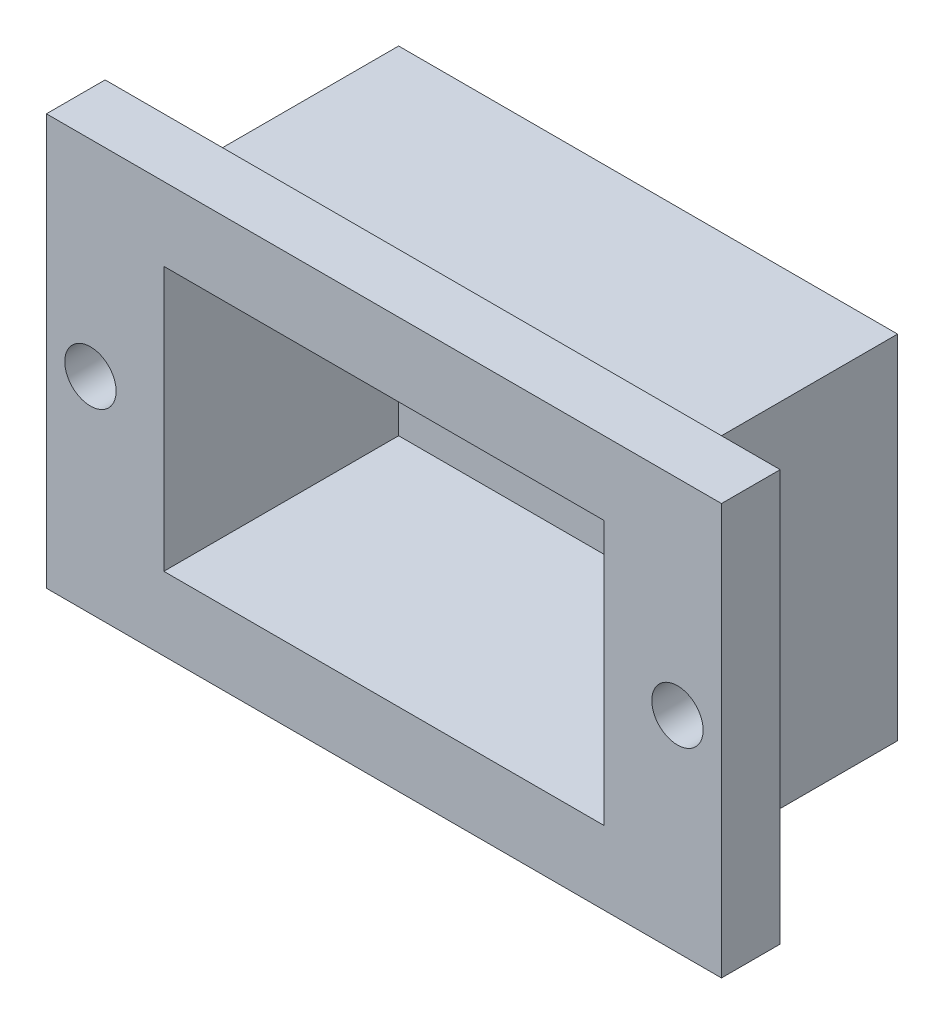
ISO-10303-21;
HEADER;
FILE_DESCRIPTION(('STEP AP214'),'2;1');
FILE_NAME('part.step','',(''),(''),'','','');
FILE_SCHEMA(('AUTOMOTIVE_DESIGN { 1 0 10303 214 1 1 1 1 }'));
ENDSEC;
DATA;
#1=APPLICATION_CONTEXT('core data for automotive mechanical design processes');
#2=APPLICATION_PROTOCOL_DEFINITION('international standard','automotive_design',2000,#1);
#3=PRODUCT_CONTEXT('',#1,'mechanical');
#4=PRODUCT('Part','Part','',(#3));
#5=PRODUCT_RELATED_PRODUCT_CATEGORY('part','',(#4));
#6=PRODUCT_DEFINITION_FORMATION('','',#4);
#7=PRODUCT_DEFINITION_CONTEXT('part definition',#1,'design');
#8=PRODUCT_DEFINITION('design','',#6,#7);
#9=PRODUCT_DEFINITION_SHAPE('','',#8);
#10=(LENGTH_UNIT() NAMED_UNIT(*) SI_UNIT(.MILLI.,.METRE.));
#11=(NAMED_UNIT(*) PLANE_ANGLE_UNIT() SI_UNIT($,.RADIAN.));
#12=(NAMED_UNIT(*) SI_UNIT($,.STERADIAN.) SOLID_ANGLE_UNIT());
#13=UNCERTAINTY_MEASURE_WITH_UNIT(LENGTH_MEASURE(1.E-05),#10,'distance_accuracy_value','');
#14=(GEOMETRIC_REPRESENTATION_CONTEXT(3) GLOBAL_UNCERTAINTY_ASSIGNED_CONTEXT((#13)) GLOBAL_UNIT_ASSIGNED_CONTEXT((#10,
#11,#12)) REPRESENTATION_CONTEXT('',''));
#15=CARTESIAN_POINT('',(0.,0.,0.));
#16=DIRECTION('',(0.,0.,1.));
#17=DIRECTION('',(1.,0.,0.));
#18=AXIS2_PLACEMENT_3D('',#15,#16,#17);
#19=CARTESIAN_POINT('',(-23.,14.,2.));
#20=DIRECTION('',(1.,0.,0.));
#21=DIRECTION('',(0.,1.,0.));
#22=AXIS2_PLACEMENT_3D('',#19,#20,#21);
#23=PLANE('',#22);
#24=DIRECTION('',(0.,0.,-1.));
#25=VECTOR('',#24,1.);
#26=CARTESIAN_POINT('',(-23.,14.,2.));
#27=LINE('',#26,#25);
#28=CARTESIAN_POINT('',(-23.,14.,18.));
#29=VERTEX_POINT('',#28);
#30=CARTESIAN_POINT('',(-23.,14.,14.));
#31=VERTEX_POINT('',#30);
#32=EDGE_CURVE('E223',#29,#31,#27,.T.);
#33=ORIENTED_EDGE('',*,*,#32,.T.);
#34=DIRECTION('',(0.,-1.,0.));
#35=VECTOR('',#34,1.);
#36=CARTESIAN_POINT('',(-23.,14.,14.));
#37=LINE('',#36,#35);
#38=CARTESIAN_POINT('',(-23.,-14.,14.));
#39=VERTEX_POINT('',#38);
#40=EDGE_CURVE('E243',#31,#39,#37,.T.);
#41=ORIENTED_EDGE('',*,*,#40,.T.);
#42=DIRECTION('',(0.,0.,-1.));
#43=VECTOR('',#42,1.);
#44=CARTESIAN_POINT('',(-23.,-14.,2.));
#45=LINE('',#44,#43);
#46=CARTESIAN_POINT('',(-23.,-14.,18.));
#47=VERTEX_POINT('',#46);
#48=EDGE_CURVE('E235',#47,#39,#45,.T.);
#49=ORIENTED_EDGE('',*,*,#48,.F.);
#50=DIRECTION('',(0.,-1.,0.));
#51=VECTOR('',#50,1.);
#52=CARTESIAN_POINT('',(-23.,-14.,18.));
#53=LINE('',#52,#51);
#54=EDGE_CURVE('E207',#29,#47,#53,.T.);
#55=ORIENTED_EDGE('',*,*,#54,.F.);
#56=EDGE_LOOP('',(#33,#41,#49,#55));
#57=FACE_BOUND('',#56,.T.);
#58=ADVANCED_FACE('F38',(#57),#23,.F.);
#59=CARTESIAN_POINT('',(-23.,-14.,2.));
#60=DIRECTION('',(0.,1.,0.));
#61=DIRECTION('',(0.,0.,1.));
#62=AXIS2_PLACEMENT_3D('',#59,#60,#61);
#63=PLANE('',#62);
#64=DIRECTION('',(-1.,0.,0.));
#65=VECTOR('',#64,1.);
#66=CARTESIAN_POINT('',(-23.,-14.,14.));
#67=LINE('',#66,#65);
#68=CARTESIAN_POINT('',(23.,-14.,14.));
#69=VERTEX_POINT('',#68);
#70=EDGE_CURVE('E151',#69,#39,#67,.T.);
#71=ORIENTED_EDGE('',*,*,#70,.F.);
#72=DIRECTION('',(0.,0.,-1.));
#73=VECTOR('',#72,1.);
#74=CARTESIAN_POINT('',(23.,-14.,2.));
#75=LINE('',#74,#73);
#76=CARTESIAN_POINT('',(23.,-14.,18.));
#77=VERTEX_POINT('',#76);
#78=EDGE_CURVE('E231',#77,#69,#75,.T.);
#79=ORIENTED_EDGE('',*,*,#78,.F.);
#80=DIRECTION('',(1.,0.,0.));
#81=VECTOR('',#80,1.);
#82=CARTESIAN_POINT('',(23.,-14.,18.));
#83=LINE('',#82,#81);
#84=EDGE_CURVE('E211',#47,#77,#83,.T.);
#85=ORIENTED_EDGE('',*,*,#84,.F.);
#86=ORIENTED_EDGE('',*,*,#48,.T.);
#87=EDGE_LOOP('',(#71,#79,#85,#86));
#88=FACE_BOUND('',#87,.T.);
#89=ADVANCED_FACE('F290',(#88),#63,.F.);
#90=CARTESIAN_POINT('',(23.,14.,2.));
#91=DIRECTION('',(-1.,0.,0.));
#92=DIRECTION('',(0.,0.,1.));
#93=AXIS2_PLACEMENT_3D('',#90,#91,#92);
#94=PLANE('',#93);
#95=ORIENTED_EDGE('',*,*,#78,.T.);
#96=DIRECTION('',(0.,-1.,0.));
#97=VECTOR('',#96,1.);
#98=CARTESIAN_POINT('',(23.,14.,14.));
#99=LINE('',#98,#97);
#100=CARTESIAN_POINT('',(23.,14.,14.));
#101=VERTEX_POINT('',#100);
#102=EDGE_CURVE('E147',#101,#69,#99,.T.);
#103=ORIENTED_EDGE('',*,*,#102,.F.);
#104=DIRECTION('',(0.,0.,-1.));
#105=VECTOR('',#104,1.);
#106=CARTESIAN_POINT('',(23.,14.,2.));
#107=LINE('',#106,#105);
#108=CARTESIAN_POINT('',(23.,14.,18.));
#109=VERTEX_POINT('',#108);
#110=EDGE_CURVE('E227',#109,#101,#107,.T.);
#111=ORIENTED_EDGE('',*,*,#110,.F.);
#112=DIRECTION('',(0.,1.,0.));
#113=VECTOR('',#112,1.);
#114=CARTESIAN_POINT('',(23.,14.,18.));
#115=LINE('',#114,#113);
#116=EDGE_CURVE('E215',#77,#109,#115,.T.);
#117=ORIENTED_EDGE('',*,*,#116,.F.);
#118=EDGE_LOOP('',(#95,#103,#111,#117));
#119=FACE_BOUND('',#118,.T.);
#120=ADVANCED_FACE('F296',(#119),#94,.F.);
#121=CARTESIAN_POINT('',(-23.,14.,2.));
#122=DIRECTION('',(0.,-1.,0.));
#123=DIRECTION('',(1.,0.,0.));
#124=AXIS2_PLACEMENT_3D('',#121,#122,#123);
#125=PLANE('',#124);
#126=ORIENTED_EDGE('',*,*,#110,.T.);
#127=DIRECTION('',(-1.,0.,0.));
#128=VECTOR('',#127,1.);
#129=CARTESIAN_POINT('',(-23.,14.,14.));
#130=LINE('',#129,#128);
#131=EDGE_CURVE('E259',#101,#31,#130,.T.);
#132=ORIENTED_EDGE('',*,*,#131,.T.);
#133=ORIENTED_EDGE('',*,*,#32,.F.);
#134=DIRECTION('',(-1.,0.,0.));
#135=VECTOR('',#134,1.);
#136=CARTESIAN_POINT('',(-23.,14.,18.));
#137=LINE('',#136,#135);
#138=EDGE_CURVE('E219',#109,#29,#137,.T.);
#139=ORIENTED_EDGE('',*,*,#138,.F.);
#140=EDGE_LOOP('',(#126,#132,#133,#139));
#141=FACE_BOUND('',#140,.T.);
#142=ADVANCED_FACE('F301',(#141),#125,.F.);
#143=CARTESIAN_POINT('',(0.,0.,0.));
#144=DIRECTION('',(0.,0.,1.));
#145=DIRECTION('',(1.,0.,0.));
#146=AXIS2_PLACEMENT_3D('',#143,#144,#145);
#147=PLANE('',#146);
#148=DIRECTION('',(0.,-1.,0.));
#149=VECTOR('',#148,1.);
#150=CARTESIAN_POINT('',(-17.,14.,0.));
#151=LINE('',#150,#149);
#152=CARTESIAN_POINT('',(-17.,12.,0.));
#153=VERTEX_POINT('',#152);
#154=CARTESIAN_POINT('',(-17.,-12.,0.));
#155=VERTEX_POINT('',#154);
#156=EDGE_CURVE('E252',#153,#155,#151,.T.);
#157=ORIENTED_EDGE('',*,*,#156,.F.);
#158=DIRECTION('',(1.,0.,0.));
#159=VECTOR('',#158,1.);
#160=CARTESIAN_POINT('',(-23.,12.,0.));
#161=LINE('',#160,#159);
#162=CARTESIAN_POINT('',(17.,12.,0.));
#163=VERTEX_POINT('',#162);
#164=EDGE_CURVE('E53',#153,#163,#161,.T.);
#165=ORIENTED_EDGE('',*,*,#164,.T.);
#166=DIRECTION('',(0.,-1.,0.));
#167=VECTOR('',#166,1.);
#168=CARTESIAN_POINT('',(17.,14.,0.));
#169=LINE('',#168,#167);
#170=CARTESIAN_POINT('',(17.,-12.,0.));
#171=VERTEX_POINT('',#170);
#172=EDGE_CURVE('E141',#163,#171,#169,.T.);
#173=ORIENTED_EDGE('',*,*,#172,.T.);
#174=DIRECTION('',(1.,0.,0.));
#175=VECTOR('',#174,1.);
#176=CARTESIAN_POINT('',(-23.,-12.,0.));
#177=LINE('',#176,#175);
#178=EDGE_CURVE('E267',#155,#171,#177,.T.);
#179=ORIENTED_EDGE('',*,*,#178,.F.);
#180=EDGE_LOOP('',(#157,#165,#173,#179));
#181=FACE_BOUND('',#180,.T.);
#182=ADVANCED_FACE('F277',(#181),#147,.F.);
#183=CARTESIAN_POINT('',(0.,0.,18.));
#184=DIRECTION('',(0.,0.,-1.));
#185=DIRECTION('',(-1.,0.,0.));
#186=AXIS2_PLACEMENT_3D('',#183,#184,#185);
#187=PLANE('',#186);
#188=CARTESIAN_POINT('',(20.,0.,18.));
#189=DIRECTION('',(0.,0.,-1.));
#190=DIRECTION('',(-1.,0.,0.));
#191=AXIS2_PLACEMENT_3D('',#188,#189,#190);
#192=CIRCLE('',#191,1.75);
#193=CARTESIAN_POINT('',(18.25,0.,18.));
#194=VERTEX_POINT('',#193);
#195=EDGE_CURVE('E157',#194,#194,#192,.T.);
#196=ORIENTED_EDGE('',*,*,#195,.T.);
#197=EDGE_LOOP('',(#196));
#198=FACE_BOUND('',#197,.T.);
#199=CARTESIAN_POINT('',(-20.,0.,18.));
#200=DIRECTION('',(0.,0.,-1.));
#201=DIRECTION('',(-1.,0.,0.));
#202=AXIS2_PLACEMENT_3D('',#199,#200,#201);
#203=CIRCLE('',#202,1.75);
#204=CARTESIAN_POINT('',(-21.75,0.,18.));
#205=VERTEX_POINT('',#204);
#206=EDGE_CURVE('E162',#205,#205,#203,.T.);
#207=ORIENTED_EDGE('',*,*,#206,.T.);
#208=EDGE_LOOP('',(#207));
#209=FACE_BOUND('',#208,.T.);
#210=ORIENTED_EDGE('',*,*,#54,.T.);
#211=ORIENTED_EDGE('',*,*,#84,.T.);
#212=ORIENTED_EDGE('',*,*,#116,.T.);
#213=ORIENTED_EDGE('',*,*,#138,.T.);
#214=EDGE_LOOP('',(#210,#211,#212,#213));
#215=FACE_BOUND('',#214,.T.);
#216=DIRECTION('',(-1.,0.,0.));
#217=VECTOR('',#216,1.);
#218=CARTESIAN_POINT('',(15.,9.,18.));
#219=LINE('',#218,#217);
#220=CARTESIAN_POINT('',(15.,9.,18.));
#221=VERTEX_POINT('',#220);
#222=CARTESIAN_POINT('',(-15.,8.99999999999999,18.));
#223=VERTEX_POINT('',#222);
#224=EDGE_CURVE('E167',#221,#223,#219,.T.);
#225=ORIENTED_EDGE('',*,*,#224,.F.);
#226=DIRECTION('',(0.,1.,0.));
#227=VECTOR('',#226,1.);
#228=CARTESIAN_POINT('',(15.,-9.,18.));
#229=LINE('',#228,#227);
#230=CARTESIAN_POINT('',(15.,-9.,18.));
#231=VERTEX_POINT('',#230);
#232=EDGE_CURVE('E178',#231,#221,#229,.T.);
#233=ORIENTED_EDGE('',*,*,#232,.F.);
#234=DIRECTION('',(1.,0.,0.));
#235=VECTOR('',#234,1.);
#236=CARTESIAN_POINT('',(-15.,-9.,18.));
#237=LINE('',#236,#235);
#238=CARTESIAN_POINT('',(-15.,-9.,18.));
#239=VERTEX_POINT('',#238);
#240=EDGE_CURVE('E174',#239,#231,#237,.T.);
#241=ORIENTED_EDGE('',*,*,#240,.F.);
#242=DIRECTION('',(0.,-1.,0.));
#243=VECTOR('',#242,1.);
#244=CARTESIAN_POINT('',(-15.,8.99999999999999,18.));
#245=LINE('',#244,#243);
#246=EDGE_CURVE('E170',#223,#239,#245,.T.);
#247=ORIENTED_EDGE('',*,*,#246,.F.);
#248=EDGE_LOOP('',(#225,#233,#241,#247));
#249=FACE_BOUND('',#248,.T.);
#250=ADVANCED_FACE('F303',(#198,#209,#215,#249),#187,.F.);
#251=CARTESIAN_POINT('',(15.,9.,18.));
#252=DIRECTION('',(0.,-1.,0.));
#253=DIRECTION('',(1.,0.,0.));
#254=AXIS2_PLACEMENT_3D('',#251,#252,#253);
#255=PLANE('',#254);
#256=DIRECTION('',(-1.,0.,0.));
#257=VECTOR('',#256,1.);
#258=CARTESIAN_POINT('',(15.,9.,2.));
#259=LINE('',#258,#257);
#260=CARTESIAN_POINT('',(15.,9.,2.));
#261=VERTEX_POINT('',#260);
#262=CARTESIAN_POINT('',(-15.,8.99999999999999,2.));
#263=VERTEX_POINT('',#262);
#264=EDGE_CURVE('E161',#261,#263,#259,.T.);
#265=ORIENTED_EDGE('',*,*,#264,.F.);
#266=DIRECTION('',(0.,0.,-1.));
#267=VECTOR('',#266,1.);
#268=CARTESIAN_POINT('',(15.,9.,18.));
#269=LINE('',#268,#267);
#270=EDGE_CURVE('E181',#221,#261,#269,.T.);
#271=ORIENTED_EDGE('',*,*,#270,.F.);
#272=ORIENTED_EDGE('',*,*,#224,.T.);
#273=DIRECTION('',(0.,0.,-1.));
#274=VECTOR('',#273,1.);
#275=CARTESIAN_POINT('',(-15.,8.99999999999999,18.));
#276=LINE('',#275,#274);
#277=EDGE_CURVE('E203',#223,#263,#276,.T.);
#278=ORIENTED_EDGE('',*,*,#277,.T.);
#279=EDGE_LOOP('',(#265,#271,#272,#278));
#280=FACE_BOUND('',#279,.T.);
#281=ADVANCED_FACE('F323',(#280),#255,.T.);
#282=CARTESIAN_POINT('',(-15.,8.99999999999999,18.));
#283=DIRECTION('',(1.,0.,0.));
#284=DIRECTION('',(0.,1.,0.));
#285=AXIS2_PLACEMENT_3D('',#282,#283,#284);
#286=PLANE('',#285);
#287=DIRECTION('',(0.,-1.,0.));
#288=VECTOR('',#287,1.);
#289=CARTESIAN_POINT('',(-15.,8.99999999999999,2.));
#290=LINE('',#289,#288);
#291=CARTESIAN_POINT('',(-15.,-9.,2.));
#292=VERTEX_POINT('',#291);
#293=EDGE_CURVE('E184',#263,#292,#290,.T.);
#294=ORIENTED_EDGE('',*,*,#293,.F.);
#295=ORIENTED_EDGE('',*,*,#277,.F.);
#296=ORIENTED_EDGE('',*,*,#246,.T.);
#297=DIRECTION('',(0.,0.,-1.));
#298=VECTOR('',#297,1.);
#299=CARTESIAN_POINT('',(-15.,-9.,18.));
#300=LINE('',#299,#298);
#301=EDGE_CURVE('E199',#239,#292,#300,.T.);
#302=ORIENTED_EDGE('',*,*,#301,.T.);
#303=EDGE_LOOP('',(#294,#295,#296,#302));
#304=FACE_BOUND('',#303,.T.);
#305=ADVANCED_FACE('F345',(#304),#286,.T.);
#306=CARTESIAN_POINT('',(-15.,-9.,18.));
#307=DIRECTION('',(0.,1.,0.));
#308=DIRECTION('',(0.,0.,1.));
#309=AXIS2_PLACEMENT_3D('',#306,#307,#308);
#310=PLANE('',#309);
#311=DIRECTION('',(1.,0.,0.));
#312=VECTOR('',#311,1.);
#313=CARTESIAN_POINT('',(-15.,-9.,2.));
#314=LINE('',#313,#312);
#315=CARTESIAN_POINT('',(15.,-9.,2.));
#316=VERTEX_POINT('',#315);
#317=EDGE_CURVE('E187',#292,#316,#314,.T.);
#318=ORIENTED_EDGE('',*,*,#317,.F.);
#319=ORIENTED_EDGE('',*,*,#301,.F.);
#320=ORIENTED_EDGE('',*,*,#240,.T.);
#321=DIRECTION('',(0.,0.,-1.));
#322=VECTOR('',#321,1.);
#323=CARTESIAN_POINT('',(15.,-9.,18.));
#324=LINE('',#323,#322);
#325=EDGE_CURVE('E195',#231,#316,#324,.T.);
#326=ORIENTED_EDGE('',*,*,#325,.T.);
#327=EDGE_LOOP('',(#318,#319,#320,#326));
#328=FACE_BOUND('',#327,.T.);
#329=ADVANCED_FACE('F341',(#328),#310,.T.);
#330=CARTESIAN_POINT('',(15.,-9.,18.));
#331=DIRECTION('',(-1.,0.,0.));
#332=DIRECTION('',(0.,-1.,0.));
#333=AXIS2_PLACEMENT_3D('',#330,#331,#332);
#334=PLANE('',#333);
#335=DIRECTION('',(0.,1.,0.));
#336=VECTOR('',#335,1.);
#337=CARTESIAN_POINT('',(15.,-9.,2.));
#338=LINE('',#337,#336);
#339=EDGE_CURVE('E171',#316,#261,#338,.T.);
#340=ORIENTED_EDGE('',*,*,#339,.F.);
#341=ORIENTED_EDGE('',*,*,#325,.F.);
#342=ORIENTED_EDGE('',*,*,#232,.T.);
#343=ORIENTED_EDGE('',*,*,#270,.T.);
#344=EDGE_LOOP('',(#340,#341,#342,#343));
#345=FACE_BOUND('',#344,.T.);
#346=ADVANCED_FACE('F334',(#345),#334,.T.);
#347=CARTESIAN_POINT('',(0.,0.,2.));
#348=DIRECTION('',(0.,0.,1.));
#349=DIRECTION('',(1.,0.,0.));
#350=AXIS2_PLACEMENT_3D('',#347,#348,#349);
#351=PLANE('',#350);
#352=ORIENTED_EDGE('',*,*,#264,.T.);
#353=ORIENTED_EDGE('',*,*,#293,.T.);
#354=ORIENTED_EDGE('',*,*,#317,.T.);
#355=ORIENTED_EDGE('',*,*,#339,.T.);
#356=EDGE_LOOP('',(#352,#353,#354,#355));
#357=FACE_BOUND('',#356,.T.);
#358=ADVANCED_FACE('F328',(#357),#351,.T.);
#359=CARTESIAN_POINT('',(-20.,0.,18.));
#360=DIRECTION('',(0.,0.,-1.));
#361=DIRECTION('',(-1.,0.,0.));
#362=AXIS2_PLACEMENT_3D('',#359,#360,#361);
#363=CYLINDRICAL_SURFACE('',#362,1.75);
#364=CARTESIAN_POINT('',(-20.,0.,14.));
#365=DIRECTION('',(0.,0.,1.));
#366=DIRECTION('',(1.,0.,0.));
#367=AXIS2_PLACEMENT_3D('',#364,#365,#366);
#368=CIRCLE('',#367,1.75);
#369=CARTESIAN_POINT('',(-18.25,0.,14.));
#370=VERTEX_POINT('',#369);
#371=EDGE_CURVE('E166',#370,#370,#368,.F.);
#372=ORIENTED_EDGE('',*,*,#371,.T.);
#373=EDGE_LOOP('',(#372));
#374=FACE_BOUND('',#373,.T.);
#375=ORIENTED_EDGE('',*,*,#206,.F.);
#376=EDGE_LOOP('',(#375));
#377=FACE_BOUND('',#376,.T.);
#378=ADVANCED_FACE('F317',(#374,#377),#363,.F.);
#379=CARTESIAN_POINT('',(20.,0.,18.));
#380=DIRECTION('',(0.,0.,-1.));
#381=DIRECTION('',(-1.,0.,0.));
#382=AXIS2_PLACEMENT_3D('',#379,#380,#381);
#383=CYLINDRICAL_SURFACE('',#382,1.75);
#384=CARTESIAN_POINT('',(20.,0.,14.));
#385=DIRECTION('',(0.,0.,1.));
#386=DIRECTION('',(1.,0.,0.));
#387=AXIS2_PLACEMENT_3D('',#384,#385,#386);
#388=CIRCLE('',#387,1.75);
#389=CARTESIAN_POINT('',(21.75,0.,14.));
#390=VERTEX_POINT('',#389);
#391=EDGE_CURVE('E239',#390,#390,#388,.F.);
#392=ORIENTED_EDGE('',*,*,#391,.T.);
#393=EDGE_LOOP('',(#392));
#394=FACE_BOUND('',#393,.T.);
#395=ORIENTED_EDGE('',*,*,#195,.F.);
#396=EDGE_LOOP('',(#395));
#397=FACE_BOUND('',#396,.T.);
#398=ADVANCED_FACE('F314',(#394,#397),#383,.F.);
#399=CARTESIAN_POINT('',(17.,14.,0.));
#400=DIRECTION('',(-1.,0.,0.));
#401=DIRECTION('',(0.,0.,1.));
#402=AXIS2_PLACEMENT_3D('',#399,#400,#401);
#403=PLANE('',#402);
#404=ORIENTED_EDGE('',*,*,#172,.F.);
#405=DIRECTION('',(0.,0.,-1.));
#406=VECTOR('',#405,1.);
#407=CARTESIAN_POINT('',(17.,12.,0.));
#408=LINE('',#407,#406);
#409=CARTESIAN_POINT('',(17.,12.,14.));
#410=VERTEX_POINT('',#409);
#411=EDGE_CURVE('E127',#410,#163,#408,.T.);
#412=ORIENTED_EDGE('',*,*,#411,.F.);
#413=DIRECTION('',(0.,-1.,0.));
#414=VECTOR('',#413,1.);
#415=CARTESIAN_POINT('',(17.,14.,14.));
#416=LINE('',#415,#414);
#417=CARTESIAN_POINT('',(17.,-12.,14.));
#418=VERTEX_POINT('',#417);
#419=EDGE_CURVE('E139',#410,#418,#416,.T.);
#420=ORIENTED_EDGE('',*,*,#419,.T.);
#421=DIRECTION('',(0.,0.,1.));
#422=VECTOR('',#421,1.);
#423=CARTESIAN_POINT('',(17.,-12.,14.));
#424=LINE('',#423,#422);
#425=EDGE_CURVE('E270',#171,#418,#424,.T.);
#426=ORIENTED_EDGE('',*,*,#425,.F.);
#427=EDGE_LOOP('',(#404,#412,#420,#426));
#428=FACE_BOUND('',#427,.T.);
#429=ADVANCED_FACE('F137',(#428),#403,.F.);
#430=CARTESIAN_POINT('',(-23.,14.,14.));
#431=DIRECTION('',(0.,0.,1.));
#432=DIRECTION('',(1.,0.,0.));
#433=AXIS2_PLACEMENT_3D('',#430,#431,#432);
#434=PLANE('',#433);
#435=ORIENTED_EDGE('',*,*,#419,.F.);
#436=DIRECTION('',(1.,0.,0.));
#437=VECTOR('',#436,1.);
#438=CARTESIAN_POINT('',(-23.,12.,14.));
#439=LINE('',#438,#437);
#440=CARTESIAN_POINT('',(-17.,12.,14.));
#441=VERTEX_POINT('',#440);
#442=EDGE_CURVE('E124',#441,#410,#439,.T.);
#443=ORIENTED_EDGE('',*,*,#442,.F.);
#444=DIRECTION('',(0.,-1.,0.));
#445=VECTOR('',#444,1.);
#446=CARTESIAN_POINT('',(-17.,14.,14.));
#447=LINE('',#446,#445);
#448=CARTESIAN_POINT('',(-17.,-12.,14.));
#449=VERTEX_POINT('',#448);
#450=EDGE_CURVE('E250',#441,#449,#447,.T.);
#451=ORIENTED_EDGE('',*,*,#450,.T.);
#452=DIRECTION('',(1.,0.,0.));
#453=VECTOR('',#452,1.);
#454=CARTESIAN_POINT('',(-23.,-12.,14.));
#455=LINE('',#454,#453);
#456=EDGE_CURVE('E60',#449,#418,#455,.T.);
#457=ORIENTED_EDGE('',*,*,#456,.T.);
#458=EDGE_LOOP('',(#435,#443,#451,#457));
#459=FACE_BOUND('',#458,.T.);
#460=ORIENTED_EDGE('',*,*,#70,.T.);
#461=ORIENTED_EDGE('',*,*,#40,.F.);
#462=ORIENTED_EDGE('',*,*,#131,.F.);
#463=ORIENTED_EDGE('',*,*,#102,.T.);
#464=EDGE_LOOP('',(#460,#461,#462,#463));
#465=FACE_BOUND('',#464,.T.);
#466=ORIENTED_EDGE('',*,*,#371,.F.);
#467=EDGE_LOOP('',(#466));
#468=FACE_BOUND('',#467,.T.);
#469=ORIENTED_EDGE('',*,*,#391,.F.);
#470=EDGE_LOOP('',(#469));
#471=FACE_BOUND('',#470,.T.);
#472=ADVANCED_FACE('F144',(#459,#465,#468,#471),#434,.F.);
#473=CARTESIAN_POINT('',(-17.,14.,14.));
#474=DIRECTION('',(1.,0.,0.));
#475=DIRECTION('',(0.,1.,0.));
#476=AXIS2_PLACEMENT_3D('',#473,#474,#475);
#477=PLANE('',#476);
#478=ORIENTED_EDGE('',*,*,#450,.F.);
#479=DIRECTION('',(0.,0.,-1.));
#480=VECTOR('',#479,1.);
#481=CARTESIAN_POINT('',(-17.,12.,14.));
#482=LINE('',#481,#480);
#483=EDGE_CURVE('E11',#441,#153,#482,.T.);
#484=ORIENTED_EDGE('',*,*,#483,.T.);
#485=ORIENTED_EDGE('',*,*,#156,.T.);
#486=DIRECTION('',(0.,0.,1.));
#487=VECTOR('',#486,1.);
#488=CARTESIAN_POINT('',(-17.,-12.,14.));
#489=LINE('',#488,#487);
#490=EDGE_CURVE('E46',#155,#449,#489,.T.);
#491=ORIENTED_EDGE('',*,*,#490,.T.);
#492=EDGE_LOOP('',(#478,#484,#485,#491));
#493=FACE_BOUND('',#492,.T.);
#494=ADVANCED_FACE('F249',(#493),#477,.F.);
#495=CARTESIAN_POINT('',(-23.,-12.,14.));
#496=DIRECTION('',(0.,1.,0.));
#497=DIRECTION('',(-1.,0.,0.));
#498=AXIS2_PLACEMENT_3D('',#495,#496,#497);
#499=PLANE('',#498);
#500=ORIENTED_EDGE('',*,*,#178,.T.);
#501=ORIENTED_EDGE('',*,*,#425,.T.);
#502=ORIENTED_EDGE('',*,*,#456,.F.);
#503=ORIENTED_EDGE('',*,*,#490,.F.);
#504=EDGE_LOOP('',(#500,#501,#502,#503));
#505=FACE_BOUND('',#504,.T.);
#506=ADVANCED_FACE('F278',(#505),#499,.F.);
#507=CARTESIAN_POINT('',(-23.,12.,0.));
#508=DIRECTION('',(0.,-1.,0.));
#509=DIRECTION('',(0.,0.,-1.));
#510=AXIS2_PLACEMENT_3D('',#507,#508,#509);
#511=PLANE('',#510);
#512=ORIENTED_EDGE('',*,*,#442,.T.);
#513=ORIENTED_EDGE('',*,*,#411,.T.);
#514=ORIENTED_EDGE('',*,*,#164,.F.);
#515=ORIENTED_EDGE('',*,*,#483,.F.);
#516=EDGE_LOOP('',(#512,#513,#514,#515));
#517=FACE_BOUND('',#516,.T.);
#518=ADVANCED_FACE('F126',(#517),#511,.F.);
#519=CLOSED_SHELL('',(#58,#89,#120,#142,#182,#250,#281,#305,#329,#346,#358,#378,#398,#429,#472,
#494,#506,#518));
#520=MANIFOLD_SOLID_BREP('B2',#519);
#521=ADVANCED_BREP_SHAPE_REPRESENTATION('',(#18,#520),#14);
#522=SHAPE_DEFINITION_REPRESENTATION(#9,#521);
ENDSEC;
END-ISO-10303-21;
